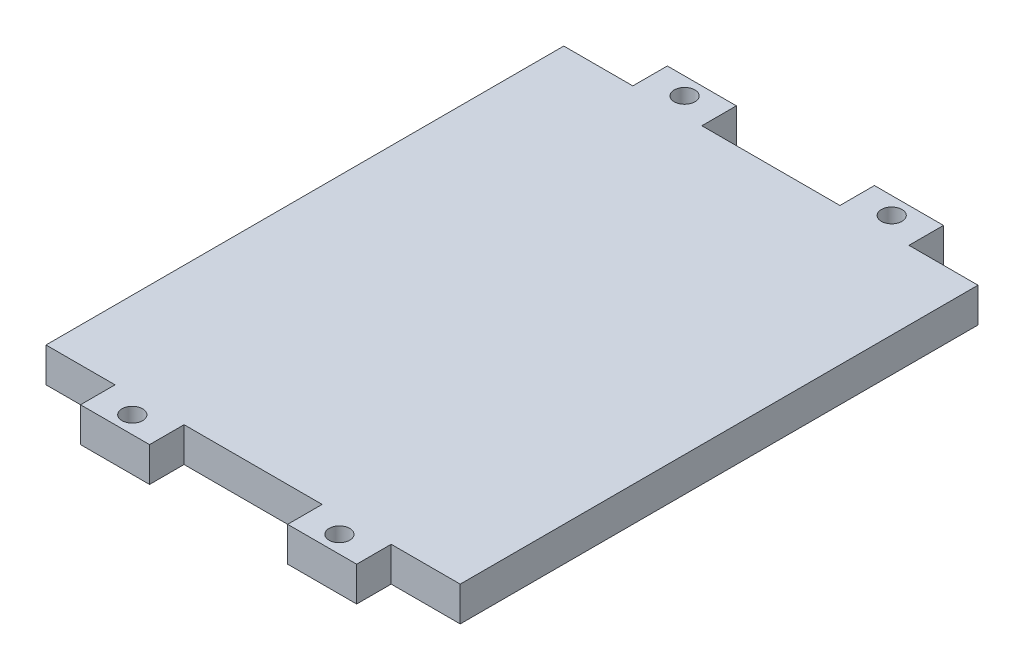
ISO-10303-21;
HEADER;
FILE_DESCRIPTION(('STEP AP214'),'2;1');
FILE_NAME('part.step','',(''),(''),'','','');
FILE_SCHEMA(('AUTOMOTIVE_DESIGN { 1 0 10303 214 1 1 1 1 }'));
ENDSEC;
DATA;
#1=APPLICATION_CONTEXT('core data for automotive mechanical design processes');
#2=APPLICATION_PROTOCOL_DEFINITION('international standard','automotive_design',2000,#1);
#3=PRODUCT_CONTEXT('',#1,'mechanical');
#4=PRODUCT('Part','Part','',(#3));
#5=PRODUCT_RELATED_PRODUCT_CATEGORY('part','',(#4));
#6=PRODUCT_DEFINITION_FORMATION('','',#4);
#7=PRODUCT_DEFINITION_CONTEXT('part definition',#1,'design');
#8=PRODUCT_DEFINITION('design','',#6,#7);
#9=PRODUCT_DEFINITION_SHAPE('','',#8);
#10=(LENGTH_UNIT() NAMED_UNIT(*) SI_UNIT(.MILLI.,.METRE.));
#11=(NAMED_UNIT(*) PLANE_ANGLE_UNIT() SI_UNIT($,.RADIAN.));
#12=(NAMED_UNIT(*) SI_UNIT($,.STERADIAN.) SOLID_ANGLE_UNIT());
#13=UNCERTAINTY_MEASURE_WITH_UNIT(LENGTH_MEASURE(1.E-05),#10,'distance_accuracy_value','');
#14=(GEOMETRIC_REPRESENTATION_CONTEXT(3) GLOBAL_UNCERTAINTY_ASSIGNED_CONTEXT((#13)) GLOBAL_UNIT_ASSIGNED_CONTEXT((#10,
#11,#12)) REPRESENTATION_CONTEXT('',''));
#15=CARTESIAN_POINT('',(0.,0.,0.));
#16=DIRECTION('',(0.,0.,1.));
#17=DIRECTION('',(1.,0.,0.));
#18=AXIS2_PLACEMENT_3D('',#15,#16,#17);
#19=CARTESIAN_POINT('',(-38.1,6.35,53.975));
#20=DIRECTION('',(0.,0.,-1.));
#21=DIRECTION('',(-1.,0.,0.));
#22=AXIS2_PLACEMENT_3D('',#19,#20,#21);
#23=PLANE('',#22);
#24=DIRECTION('',(1.,0.,0.));
#25=VECTOR('',#24,1.);
#26=CARTESIAN_POINT('',(-38.1,6.35,53.975));
#27=LINE('',#26,#25);
#28=CARTESIAN_POINT('',(-25.4,6.35,53.975));
#29=VERTEX_POINT('',#28);
#30=CARTESIAN_POINT('',(-12.6999999999999,6.35,53.975));
#31=VERTEX_POINT('',#30);
#32=EDGE_CURVE('E50',#29,#31,#27,.T.);
#33=ORIENTED_EDGE('',*,*,#32,.F.);
#34=DIRECTION('',(0.,1.,0.));
#35=VECTOR('',#34,1.);
#36=CARTESIAN_POINT('',(-25.4,0.,53.975));
#37=LINE('',#36,#35);
#38=CARTESIAN_POINT('',(-25.4,0.,53.975));
#39=VERTEX_POINT('',#38);
#40=EDGE_CURVE('E222',#39,#29,#37,.T.);
#41=ORIENTED_EDGE('',*,*,#40,.F.);
#42=DIRECTION('',(1.,0.,0.));
#43=VECTOR('',#42,1.);
#44=CARTESIAN_POINT('',(-38.1,0.,53.975));
#45=LINE('',#44,#43);
#46=CARTESIAN_POINT('',(-12.6999999999999,0.,53.975));
#47=VERTEX_POINT('',#46);
#48=EDGE_CURVE('E233',#39,#47,#45,.T.);
#49=ORIENTED_EDGE('',*,*,#48,.T.);
#50=DIRECTION('',(0.,1.,0.));
#51=VECTOR('',#50,1.);
#52=CARTESIAN_POINT('',(-12.6999999999999,0.,53.975));
#53=LINE('',#52,#51);
#54=EDGE_CURVE('E376',#47,#31,#53,.T.);
#55=ORIENTED_EDGE('',*,*,#54,.T.);
#56=EDGE_LOOP('',(#33,#41,#49,#55));
#57=FACE_BOUND('',#56,.T.);
#58=ADVANCED_FACE('F40',(#57),#23,.F.);
#59=CARTESIAN_POINT('',(-38.1,6.35,-53.975));
#60=DIRECTION('',(0.,0.,1.));
#61=DIRECTION('',(1.,0.,0.));
#62=AXIS2_PLACEMENT_3D('',#59,#60,#61);
#63=PLANE('',#62);
#64=DIRECTION('',(-1.,0.,0.));
#65=VECTOR('',#64,1.);
#66=CARTESIAN_POINT('',(-38.1,6.35,-53.975));
#67=LINE('',#66,#65);
#68=CARTESIAN_POINT('',(-12.7,6.35,-53.975));
#69=VERTEX_POINT('',#68);
#70=CARTESIAN_POINT('',(-25.4,6.35,-53.975));
#71=VERTEX_POINT('',#70);
#72=EDGE_CURVE('E246',#69,#71,#67,.T.);
#73=ORIENTED_EDGE('',*,*,#72,.F.);
#74=DIRECTION('',(0.,1.,0.));
#75=VECTOR('',#74,1.);
#76=CARTESIAN_POINT('',(-12.7,0.,-53.975));
#77=LINE('',#76,#75);
#78=CARTESIAN_POINT('',(-12.7,0.,-53.975));
#79=VERTEX_POINT('',#78);
#80=EDGE_CURVE('E287',#79,#69,#77,.T.);
#81=ORIENTED_EDGE('',*,*,#80,.F.);
#82=DIRECTION('',(-1.,0.,0.));
#83=VECTOR('',#82,1.);
#84=CARTESIAN_POINT('',(-38.1,0.,-53.975));
#85=LINE('',#84,#83);
#86=CARTESIAN_POINT('',(-25.4,0.,-53.975));
#87=VERTEX_POINT('',#86);
#88=EDGE_CURVE('E255',#79,#87,#85,.T.);
#89=ORIENTED_EDGE('',*,*,#88,.T.);
#90=DIRECTION('',(0.,1.,0.));
#91=VECTOR('',#90,1.);
#92=CARTESIAN_POINT('',(-25.4,0.,-53.975));
#93=LINE('',#92,#91);
#94=EDGE_CURVE('E274',#87,#71,#93,.T.);
#95=ORIENTED_EDGE('',*,*,#94,.T.);
#96=EDGE_LOOP('',(#73,#81,#89,#95));
#97=FACE_BOUND('',#96,.T.);
#98=ADVANCED_FACE('F490',(#97),#63,.F.);
#99=CARTESIAN_POINT('',(25.4,6.35,-53.975));
#100=VERTEX_POINT('',#99);
#101=CARTESIAN_POINT('',(12.7,6.35,-53.975));
#102=VERTEX_POINT('',#101);
#103=EDGE_CURVE('E264',#100,#102,#67,.T.);
#104=ORIENTED_EDGE('',*,*,#103,.F.);
#105=DIRECTION('',(0.,1.,0.));
#106=VECTOR('',#105,1.);
#107=CARTESIAN_POINT('',(25.4,0.,-53.975));
#108=LINE('',#107,#106);
#109=CARTESIAN_POINT('',(25.4,0.,-53.975));
#110=VERTEX_POINT('',#109);
#111=EDGE_CURVE('E331',#110,#100,#108,.T.);
#112=ORIENTED_EDGE('',*,*,#111,.F.);
#113=CARTESIAN_POINT('',(12.7,0.,-53.975));
#114=VERTEX_POINT('',#113);
#115=EDGE_CURVE('E253',#110,#114,#85,.T.);
#116=ORIENTED_EDGE('',*,*,#115,.T.);
#117=DIRECTION('',(0.,1.,0.));
#118=VECTOR('',#117,1.);
#119=CARTESIAN_POINT('',(12.7,0.,-53.975));
#120=LINE('',#119,#118);
#121=EDGE_CURVE('E301',#114,#102,#120,.T.);
#122=ORIENTED_EDGE('',*,*,#121,.T.);
#123=EDGE_LOOP('',(#104,#112,#116,#122));
#124=FACE_BOUND('',#123,.T.);
#125=ADVANCED_FACE('F42',(#124),#63,.F.);
#126=CARTESIAN_POINT('',(-38.1,6.35,-53.975));
#127=DIRECTION('',(1.,0.,0.));
#128=DIRECTION('',(0.,0.,-1.));
#129=AXIS2_PLACEMENT_3D('',#126,#127,#128);
#130=PLANE('',#129);
#131=DIRECTION('',(0.,0.,1.));
#132=VECTOR('',#131,1.);
#133=CARTESIAN_POINT('',(-38.1,0.,-53.975));
#134=LINE('',#133,#132);
#135=CARTESIAN_POINT('',(-38.1,0.,-47.625));
#136=VERTEX_POINT('',#135);
#137=CARTESIAN_POINT('',(-38.1,0.,47.625));
#138=VERTEX_POINT('',#137);
#139=EDGE_CURVE('E248',#136,#138,#134,.T.);
#140=ORIENTED_EDGE('',*,*,#139,.T.);
#141=DIRECTION('',(0.,1.,0.));
#142=VECTOR('',#141,1.);
#143=CARTESIAN_POINT('',(-38.1,0.,47.625));
#144=LINE('',#143,#142);
#145=CARTESIAN_POINT('',(-38.1,6.35,47.625));
#146=VERTEX_POINT('',#145);
#147=EDGE_CURVE('E407',#138,#146,#144,.T.);
#148=ORIENTED_EDGE('',*,*,#147,.T.);
#149=DIRECTION('',(0.,0.,1.));
#150=VECTOR('',#149,1.);
#151=CARTESIAN_POINT('',(-38.1,6.35,-53.975));
#152=LINE('',#151,#150);
#153=CARTESIAN_POINT('',(-38.1,6.35,-47.625));
#154=VERTEX_POINT('',#153);
#155=EDGE_CURVE('E260',#154,#146,#152,.T.);
#156=ORIENTED_EDGE('',*,*,#155,.F.);
#157=DIRECTION('',(0.,1.,0.));
#158=VECTOR('',#157,1.);
#159=CARTESIAN_POINT('',(-38.1,0.,-47.625));
#160=LINE('',#159,#158);
#161=EDGE_CURVE('E267',#136,#154,#160,.T.);
#162=ORIENTED_EDGE('',*,*,#161,.F.);
#163=EDGE_LOOP('',(#140,#148,#156,#162));
#164=FACE_BOUND('',#163,.T.);
#165=ADVANCED_FACE('F478',(#164),#130,.F.);
#166=CARTESIAN_POINT('',(12.7,6.35,53.975));
#167=VERTEX_POINT('',#166);
#168=CARTESIAN_POINT('',(25.4000000000001,6.35,53.975));
#169=VERTEX_POINT('',#168);
#170=EDGE_CURVE('E259',#167,#169,#27,.T.);
#171=ORIENTED_EDGE('',*,*,#170,.F.);
#172=DIRECTION('',(0.,1.,0.));
#173=VECTOR('',#172,1.);
#174=CARTESIAN_POINT('',(12.7,0.,53.975));
#175=LINE('',#174,#173);
#176=CARTESIAN_POINT('',(12.7,0.,53.975));
#177=VERTEX_POINT('',#176);
#178=EDGE_CURVE('E383',#177,#167,#175,.T.);
#179=ORIENTED_EDGE('',*,*,#178,.F.);
#180=CARTESIAN_POINT('',(25.4000000000001,0.,53.975));
#181=VERTEX_POINT('',#180);
#182=EDGE_CURVE('E242',#177,#181,#45,.T.);
#183=ORIENTED_EDGE('',*,*,#182,.T.);
#184=DIRECTION('',(0.,1.,0.));
#185=VECTOR('',#184,1.);
#186=CARTESIAN_POINT('',(25.4000000000001,0.,53.975));
#187=LINE('',#186,#185);
#188=EDGE_CURVE('E350',#181,#169,#187,.T.);
#189=ORIENTED_EDGE('',*,*,#188,.T.);
#190=EDGE_LOOP('',(#171,#179,#183,#189));
#191=FACE_BOUND('',#190,.T.);
#192=ADVANCED_FACE('F505',(#191),#23,.F.);
#193=CARTESIAN_POINT('',(38.1,6.35,-53.975));
#194=DIRECTION('',(-1.,0.,0.));
#195=DIRECTION('',(0.,0.,1.));
#196=AXIS2_PLACEMENT_3D('',#193,#194,#195);
#197=PLANE('',#196);
#198=DIRECTION('',(0.,0.,-1.));
#199=VECTOR('',#198,1.);
#200=CARTESIAN_POINT('',(38.1,6.35,-53.975));
#201=LINE('',#200,#199);
#202=CARTESIAN_POINT('',(38.1,6.35,47.625));
#203=VERTEX_POINT('',#202);
#204=CARTESIAN_POINT('',(38.1,6.35,-47.625));
#205=VERTEX_POINT('',#204);
#206=EDGE_CURVE('E11',#203,#205,#201,.T.);
#207=ORIENTED_EDGE('',*,*,#206,.F.);
#208=DIRECTION('',(0.,1.,0.));
#209=VECTOR('',#208,1.);
#210=CARTESIAN_POINT('',(38.1,0.,47.625));
#211=LINE('',#210,#209);
#212=CARTESIAN_POINT('',(38.1,0.,47.625));
#213=VERTEX_POINT('',#212);
#214=EDGE_CURVE('E357',#213,#203,#211,.T.);
#215=ORIENTED_EDGE('',*,*,#214,.F.);
#216=DIRECTION('',(0.,0.,-1.));
#217=VECTOR('',#216,1.);
#218=CARTESIAN_POINT('',(38.1,0.,-53.975));
#219=LINE('',#218,#217);
#220=CARTESIAN_POINT('',(38.1,0.,-47.625));
#221=VERTEX_POINT('',#220);
#222=EDGE_CURVE('E44',#213,#221,#219,.T.);
#223=ORIENTED_EDGE('',*,*,#222,.T.);
#224=DIRECTION('',(0.,1.,0.));
#225=VECTOR('',#224,1.);
#226=CARTESIAN_POINT('',(38.1,0.,-47.625));
#227=LINE('',#226,#225);
#228=EDGE_CURVE('E320',#221,#205,#227,.T.);
#229=ORIENTED_EDGE('',*,*,#228,.T.);
#230=EDGE_LOOP('',(#207,#215,#223,#229));
#231=FACE_BOUND('',#230,.T.);
#232=ADVANCED_FACE('F464',(#231),#197,.F.);
#233=CARTESIAN_POINT('',(0.,6.35,0.));
#234=DIRECTION('',(0.,-1.,0.));
#235=DIRECTION('',(0.,0.,-1.));
#236=AXIS2_PLACEMENT_3D('',#233,#234,#235);
#237=PLANE('',#236);
#238=CARTESIAN_POINT('',(-19.05,6.35,-50.8));
#239=DIRECTION('',(0.,1.,0.));
#240=DIRECTION('',(0.,0.,1.));
#241=AXIS2_PLACEMENT_3D('',#238,#239,#240);
#242=CIRCLE('',#241,1.89864999999999);
#243=CARTESIAN_POINT('',(-19.05,6.35,-48.90135));
#244=VERTEX_POINT('',#243);
#245=EDGE_CURVE('E453',#244,#244,#242,.T.);
#246=ORIENTED_EDGE('',*,*,#245,.F.);
#247=EDGE_LOOP('',(#246));
#248=FACE_BOUND('',#247,.T.);
#249=CARTESIAN_POINT('',(19.05,6.35,-50.8));
#250=DIRECTION('',(0.,1.,0.));
#251=DIRECTION('',(0.,0.,1.));
#252=AXIS2_PLACEMENT_3D('',#249,#250,#251);
#253=CIRCLE('',#252,1.89864999999999);
#254=CARTESIAN_POINT('',(19.05,6.35,-48.90135));
#255=VERTEX_POINT('',#254);
#256=EDGE_CURVE('E445',#255,#255,#253,.T.);
#257=ORIENTED_EDGE('',*,*,#256,.F.);
#258=EDGE_LOOP('',(#257));
#259=FACE_BOUND('',#258,.T.);
#260=CARTESIAN_POINT('',(-19.05,6.35,50.8));
#261=DIRECTION('',(0.,1.,0.));
#262=DIRECTION('',(0.,0.,1.));
#263=AXIS2_PLACEMENT_3D('',#260,#261,#262);
#264=CIRCLE('',#263,1.89864999999999);
#265=CARTESIAN_POINT('',(-19.05,6.35,52.69865));
#266=VERTEX_POINT('',#265);
#267=EDGE_CURVE('E437',#266,#266,#264,.T.);
#268=ORIENTED_EDGE('',*,*,#267,.F.);
#269=EDGE_LOOP('',(#268));
#270=FACE_BOUND('',#269,.T.);
#271=CARTESIAN_POINT('',(19.05,6.35,50.8));
#272=DIRECTION('',(0.,1.,0.));
#273=DIRECTION('',(0.,0.,1.));
#274=AXIS2_PLACEMENT_3D('',#271,#272,#273);
#275=CIRCLE('',#274,1.89864999999999);
#276=CARTESIAN_POINT('',(19.05,6.35,52.69865));
#277=VERTEX_POINT('',#276);
#278=EDGE_CURVE('E430',#277,#277,#275,.T.);
#279=ORIENTED_EDGE('',*,*,#278,.F.);
#280=EDGE_LOOP('',(#279));
#281=FACE_BOUND('',#280,.T.);
#282=ORIENTED_EDGE('',*,*,#155,.T.);
#283=DIRECTION('',(-1.,0.,0.));
#284=VECTOR('',#283,1.);
#285=CARTESIAN_POINT('',(-38.1,6.35,47.625));
#286=LINE('',#285,#284);
#287=CARTESIAN_POINT('',(-25.3999999999999,6.35,47.625));
#288=VERTEX_POINT('',#287);
#289=EDGE_CURVE('E228',#288,#146,#286,.T.);
#290=ORIENTED_EDGE('',*,*,#289,.F.);
#291=DIRECTION('',(0.,0.,-1.));
#292=VECTOR('',#291,1.);
#293=CARTESIAN_POINT('',(-25.4,6.35,53.975));
#294=LINE('',#293,#292);
#295=EDGE_CURVE('E421',#29,#288,#294,.T.);
#296=ORIENTED_EDGE('',*,*,#295,.F.);
#297=ORIENTED_EDGE('',*,*,#32,.T.);
#298=DIRECTION('',(0.,0.,1.));
#299=VECTOR('',#298,1.);
#300=CARTESIAN_POINT('',(-12.6999999999999,6.35,53.975));
#301=LINE('',#300,#299);
#302=CARTESIAN_POINT('',(-12.7,6.35,47.625));
#303=VERTEX_POINT('',#302);
#304=EDGE_CURVE('E394',#303,#31,#301,.T.);
#305=ORIENTED_EDGE('',*,*,#304,.F.);
#306=DIRECTION('',(-1.,0.,0.));
#307=VECTOR('',#306,1.);
#308=CARTESIAN_POINT('',(-12.7,6.35,47.625));
#309=LINE('',#308,#307);
#310=CARTESIAN_POINT('',(12.7000000000001,6.35,47.625));
#311=VERTEX_POINT('',#310);
#312=EDGE_CURVE('E399',#311,#303,#309,.T.);
#313=ORIENTED_EDGE('',*,*,#312,.F.);
#314=DIRECTION('',(0.,0.,-1.));
#315=VECTOR('',#314,1.);
#316=CARTESIAN_POINT('',(12.7,6.35,53.975));
#317=LINE('',#316,#315);
#318=EDGE_CURVE('E403',#167,#311,#317,.T.);
#319=ORIENTED_EDGE('',*,*,#318,.F.);
#320=ORIENTED_EDGE('',*,*,#170,.T.);
#321=DIRECTION('',(0.,0.,1.));
#322=VECTOR('',#321,1.);
#323=CARTESIAN_POINT('',(25.4000000000001,6.35,53.975));
#324=LINE('',#323,#322);
#325=CARTESIAN_POINT('',(25.4,6.35,47.625));
#326=VERTEX_POINT('',#325);
#327=EDGE_CURVE('E367',#326,#169,#324,.T.);
#328=ORIENTED_EDGE('',*,*,#327,.F.);
#329=DIRECTION('',(-1.,0.,0.));
#330=VECTOR('',#329,1.);
#331=CARTESIAN_POINT('',(38.1,6.35,47.625));
#332=LINE('',#331,#330);
#333=EDGE_CURVE('E372',#203,#326,#332,.T.);
#334=ORIENTED_EDGE('',*,*,#333,.F.);
#335=ORIENTED_EDGE('',*,*,#206,.T.);
#336=DIRECTION('',(1.,0.,0.));
#337=VECTOR('',#336,1.);
#338=CARTESIAN_POINT('',(38.1,6.35,-47.625));
#339=LINE('',#338,#337);
#340=CARTESIAN_POINT('',(25.4,6.35,-47.625));
#341=VERTEX_POINT('',#340);
#342=EDGE_CURVE('E341',#341,#205,#339,.T.);
#343=ORIENTED_EDGE('',*,*,#342,.F.);
#344=DIRECTION('',(0.,0.,1.));
#345=VECTOR('',#344,1.);
#346=CARTESIAN_POINT('',(25.4,6.35,-53.975));
#347=LINE('',#346,#345);
#348=EDGE_CURVE('E346',#100,#341,#347,.T.);
#349=ORIENTED_EDGE('',*,*,#348,.F.);
#350=ORIENTED_EDGE('',*,*,#103,.T.);
#351=DIRECTION('',(0.,0.,-1.));
#352=VECTOR('',#351,1.);
#353=CARTESIAN_POINT('',(12.7,6.35,-53.975));
#354=LINE('',#353,#352);
#355=CARTESIAN_POINT('',(12.7,6.35,-47.625));
#356=VERTEX_POINT('',#355);
#357=EDGE_CURVE('E307',#356,#102,#354,.T.);
#358=ORIENTED_EDGE('',*,*,#357,.F.);
#359=DIRECTION('',(1.,0.,0.));
#360=VECTOR('',#359,1.);
#361=CARTESIAN_POINT('',(-12.7,6.35,-47.625));
#362=LINE('',#361,#360);
#363=CARTESIAN_POINT('',(-12.7,6.35,-47.625));
#364=VERTEX_POINT('',#363);
#365=EDGE_CURVE('E312',#364,#356,#362,.T.);
#366=ORIENTED_EDGE('',*,*,#365,.F.);
#367=DIRECTION('',(0.,0.,1.));
#368=VECTOR('',#367,1.);
#369=CARTESIAN_POINT('',(-12.7,6.35,-53.975));
#370=LINE('',#369,#368);
#371=EDGE_CURVE('E316',#69,#364,#370,.T.);
#372=ORIENTED_EDGE('',*,*,#371,.F.);
#373=ORIENTED_EDGE('',*,*,#72,.T.);
#374=DIRECTION('',(0.,0.,-1.));
#375=VECTOR('',#374,1.);
#376=CARTESIAN_POINT('',(-25.4,6.35,-53.975));
#377=LINE('',#376,#375);
#378=CARTESIAN_POINT('',(-25.4,6.35,-47.625));
#379=VERTEX_POINT('',#378);
#380=EDGE_CURVE('E278',#379,#71,#377,.T.);
#381=ORIENTED_EDGE('',*,*,#380,.F.);
#382=DIRECTION('',(1.,0.,0.));
#383=VECTOR('',#382,1.);
#384=CARTESIAN_POINT('',(-38.1,6.35,-47.625));
#385=LINE('',#384,#383);
#386=EDGE_CURVE('E283',#154,#379,#385,.T.);
#387=ORIENTED_EDGE('',*,*,#386,.F.);
#388=EDGE_LOOP('',(#282,#290,#296,#297,#305,#313,#319,#320,#328,#334,#335,#343,#349,#350,#358,
#366,#372,#373,#381,#387));
#389=FACE_BOUND('',#388,.T.);
#390=ADVANCED_FACE('F461',(#248,#259,#270,#281,#389),#237,.F.);
#391=CARTESIAN_POINT('',(0.,0.,0.));
#392=DIRECTION('',(0.,-1.,0.));
#393=DIRECTION('',(0.,0.,-1.));
#394=AXIS2_PLACEMENT_3D('',#391,#392,#393);
#395=PLANE('',#394);
#396=CARTESIAN_POINT('',(-19.05,0.,-50.8));
#397=DIRECTION('',(0.,1.,0.));
#398=DIRECTION('',(0.,0.,1.));
#399=AXIS2_PLACEMENT_3D('',#396,#397,#398);
#400=CIRCLE('',#399,1.89864999999999);
#401=CARTESIAN_POINT('',(-19.05,0.,-48.90135));
#402=VERTEX_POINT('',#401);
#403=EDGE_CURVE('E449',#402,#402,#400,.T.);
#404=ORIENTED_EDGE('',*,*,#403,.T.);
#405=EDGE_LOOP('',(#404));
#406=FACE_BOUND('',#405,.T.);
#407=CARTESIAN_POINT('',(19.05,0.,-50.8));
#408=DIRECTION('',(0.,1.,0.));
#409=DIRECTION('',(0.,0.,1.));
#410=AXIS2_PLACEMENT_3D('',#407,#408,#409);
#411=CIRCLE('',#410,1.89864999999999);
#412=CARTESIAN_POINT('',(19.05,0.,-48.90135));
#413=VERTEX_POINT('',#412);
#414=EDGE_CURVE('E441',#413,#413,#411,.T.);
#415=ORIENTED_EDGE('',*,*,#414,.T.);
#416=EDGE_LOOP('',(#415));
#417=FACE_BOUND('',#416,.T.);
#418=CARTESIAN_POINT('',(-19.05,0.,50.8));
#419=DIRECTION('',(0.,1.,0.));
#420=DIRECTION('',(0.,0.,1.));
#421=AXIS2_PLACEMENT_3D('',#418,#419,#420);
#422=CIRCLE('',#421,1.89864999999999);
#423=CARTESIAN_POINT('',(-19.05,0.,52.69865));
#424=VERTEX_POINT('',#423);
#425=EDGE_CURVE('E434',#424,#424,#422,.T.);
#426=ORIENTED_EDGE('',*,*,#425,.T.);
#427=EDGE_LOOP('',(#426));
#428=FACE_BOUND('',#427,.T.);
#429=CARTESIAN_POINT('',(19.05,0.,50.8));
#430=DIRECTION('',(0.,1.,0.));
#431=DIRECTION('',(0.,0.,1.));
#432=AXIS2_PLACEMENT_3D('',#429,#430,#431);
#433=CIRCLE('',#432,1.89864999999999);
#434=CARTESIAN_POINT('',(19.05,0.,52.69865));
#435=VERTEX_POINT('',#434);
#436=EDGE_CURVE('E424',#435,#435,#433,.T.);
#437=ORIENTED_EDGE('',*,*,#436,.T.);
#438=EDGE_LOOP('',(#437));
#439=FACE_BOUND('',#438,.T.);
#440=DIRECTION('',(-1.,0.,0.));
#441=VECTOR('',#440,1.);
#442=CARTESIAN_POINT('',(-38.1,0.,47.625));
#443=LINE('',#442,#441);
#444=CARTESIAN_POINT('',(-25.3999999999999,0.,47.625));
#445=VERTEX_POINT('',#444);
#446=EDGE_CURVE('E61',#445,#138,#443,.T.);
#447=ORIENTED_EDGE('',*,*,#446,.T.);
#448=ORIENTED_EDGE('',*,*,#139,.F.);
#449=DIRECTION('',(1.,0.,0.));
#450=VECTOR('',#449,1.);
#451=CARTESIAN_POINT('',(-38.1,0.,-47.625));
#452=LINE('',#451,#450);
#453=CARTESIAN_POINT('',(-25.4,0.,-47.625));
#454=VERTEX_POINT('',#453);
#455=EDGE_CURVE('E282',#136,#454,#452,.T.);
#456=ORIENTED_EDGE('',*,*,#455,.T.);
#457=DIRECTION('',(0.,0.,-1.));
#458=VECTOR('',#457,1.);
#459=CARTESIAN_POINT('',(-25.4,0.,-53.975));
#460=LINE('',#459,#458);
#461=EDGE_CURVE('E271',#454,#87,#460,.T.);
#462=ORIENTED_EDGE('',*,*,#461,.T.);
#463=ORIENTED_EDGE('',*,*,#88,.F.);
#464=DIRECTION('',(0.,0.,1.));
#465=VECTOR('',#464,1.);
#466=CARTESIAN_POINT('',(-12.7,0.,-53.975));
#467=LINE('',#466,#465);
#468=CARTESIAN_POINT('',(-12.7,0.,-47.625));
#469=VERTEX_POINT('',#468);
#470=EDGE_CURVE('E311',#79,#469,#467,.T.);
#471=ORIENTED_EDGE('',*,*,#470,.T.);
#472=DIRECTION('',(1.,0.,0.));
#473=VECTOR('',#472,1.);
#474=CARTESIAN_POINT('',(-12.7,0.,-47.625));
#475=LINE('',#474,#473);
#476=CARTESIAN_POINT('',(12.7,0.,-47.625));
#477=VERTEX_POINT('',#476);
#478=EDGE_CURVE('E324',#469,#477,#475,.T.);
#479=ORIENTED_EDGE('',*,*,#478,.T.);
#480=DIRECTION('',(0.,0.,-1.));
#481=VECTOR('',#480,1.);
#482=CARTESIAN_POINT('',(12.7,0.,-53.975));
#483=LINE('',#482,#481);
#484=EDGE_CURVE('E298',#477,#114,#483,.T.);
#485=ORIENTED_EDGE('',*,*,#484,.T.);
#486=ORIENTED_EDGE('',*,*,#115,.F.);
#487=DIRECTION('',(0.,0.,1.));
#488=VECTOR('',#487,1.);
#489=CARTESIAN_POINT('',(25.4,0.,-53.975));
#490=LINE('',#489,#488);
#491=CARTESIAN_POINT('',(25.4,0.,-47.625));
#492=VERTEX_POINT('',#491);
#493=EDGE_CURVE('E345',#110,#492,#490,.T.);
#494=ORIENTED_EDGE('',*,*,#493,.T.);
#495=DIRECTION('',(1.,0.,0.));
#496=VECTOR('',#495,1.);
#497=CARTESIAN_POINT('',(38.1,0.,-47.625));
#498=LINE('',#497,#496);
#499=EDGE_CURVE('E335',#492,#221,#498,.T.);
#500=ORIENTED_EDGE('',*,*,#499,.T.);
#501=ORIENTED_EDGE('',*,*,#222,.F.);
#502=DIRECTION('',(-1.,0.,0.));
#503=VECTOR('',#502,1.);
#504=CARTESIAN_POINT('',(38.1,0.,47.625));
#505=LINE('',#504,#503);
#506=CARTESIAN_POINT('',(25.4,0.,47.625));
#507=VERTEX_POINT('',#506);
#508=EDGE_CURVE('E371',#213,#507,#505,.T.);
#509=ORIENTED_EDGE('',*,*,#508,.T.);
#510=DIRECTION('',(0.,0.,1.));
#511=VECTOR('',#510,1.);
#512=CARTESIAN_POINT('',(25.4000000000001,0.,53.975));
#513=LINE('',#512,#511);
#514=EDGE_CURVE('E361',#507,#181,#513,.T.);
#515=ORIENTED_EDGE('',*,*,#514,.T.);
#516=ORIENTED_EDGE('',*,*,#182,.F.);
#517=DIRECTION('',(0.,0.,-1.));
#518=VECTOR('',#517,1.);
#519=CARTESIAN_POINT('',(12.7,0.,53.975));
#520=LINE('',#519,#518);
#521=CARTESIAN_POINT('',(12.7000000000001,0.,47.625));
#522=VERTEX_POINT('',#521);
#523=EDGE_CURVE('E398',#177,#522,#520,.T.);
#524=ORIENTED_EDGE('',*,*,#523,.T.);
#525=DIRECTION('',(-1.,0.,0.));
#526=VECTOR('',#525,1.);
#527=CARTESIAN_POINT('',(-12.7,0.,47.625));
#528=LINE('',#527,#526);
#529=CARTESIAN_POINT('',(-12.7,0.,47.625));
#530=VERTEX_POINT('',#529);
#531=EDGE_CURVE('E72',#522,#530,#528,.T.);
#532=ORIENTED_EDGE('',*,*,#531,.T.);
#533=DIRECTION('',(0.,0.,1.));
#534=VECTOR('',#533,1.);
#535=CARTESIAN_POINT('',(-12.6999999999999,0.,53.975));
#536=LINE('',#535,#534);
#537=EDGE_CURVE('E240',#530,#47,#536,.T.);
#538=ORIENTED_EDGE('',*,*,#537,.T.);
#539=ORIENTED_EDGE('',*,*,#48,.F.);
#540=DIRECTION('',(0.,0.,-1.));
#541=VECTOR('',#540,1.);
#542=CARTESIAN_POINT('',(-25.4,0.,53.975));
#543=LINE('',#542,#541);
#544=EDGE_CURVE('E218',#39,#445,#543,.T.);
#545=ORIENTED_EDGE('',*,*,#544,.T.);
#546=EDGE_LOOP('',(#447,#448,#456,#462,#463,#471,#479,#485,#486,#494,#500,#501,#509,#515,#516,
#524,#532,#538,#539,#545));
#547=FACE_BOUND('',#546,.T.);
#548=ADVANCED_FACE('F238',(#406,#417,#428,#439,#547),#395,.T.);
#549=CARTESIAN_POINT('',(-25.4,0.,-53.975));
#550=DIRECTION('',(1.,0.,0.));
#551=DIRECTION('',(0.,0.,-1.));
#552=AXIS2_PLACEMENT_3D('',#549,#550,#551);
#553=PLANE('',#552);
#554=ORIENTED_EDGE('',*,*,#380,.T.);
#555=ORIENTED_EDGE('',*,*,#94,.F.);
#556=ORIENTED_EDGE('',*,*,#461,.F.);
#557=DIRECTION('',(0.,1.,0.));
#558=VECTOR('',#557,1.);
#559=CARTESIAN_POINT('',(-25.4,0.,-47.625));
#560=LINE('',#559,#558);
#561=EDGE_CURVE('E270',#454,#379,#560,.T.);
#562=ORIENTED_EDGE('',*,*,#561,.T.);
#563=EDGE_LOOP('',(#554,#555,#556,#562));
#564=FACE_BOUND('',#563,.T.);
#565=ADVANCED_FACE('F486',(#564),#553,.F.);
#566=CARTESIAN_POINT('',(-38.1,0.,-47.625));
#567=DIRECTION('',(0.,0.,1.));
#568=DIRECTION('',(1.,0.,0.));
#569=AXIS2_PLACEMENT_3D('',#566,#567,#568);
#570=PLANE('',#569);
#571=ORIENTED_EDGE('',*,*,#386,.T.);
#572=ORIENTED_EDGE('',*,*,#561,.F.);
#573=ORIENTED_EDGE('',*,*,#455,.F.);
#574=ORIENTED_EDGE('',*,*,#161,.T.);
#575=EDGE_LOOP('',(#571,#572,#573,#574));
#576=FACE_BOUND('',#575,.T.);
#577=ADVANCED_FACE('F484',(#576),#570,.F.);
#578=CARTESIAN_POINT('',(-12.7,0.,-53.975));
#579=DIRECTION('',(-1.,0.,0.));
#580=DIRECTION('',(0.,0.,1.));
#581=AXIS2_PLACEMENT_3D('',#578,#579,#580);
#582=PLANE('',#581);
#583=ORIENTED_EDGE('',*,*,#371,.T.);
#584=DIRECTION('',(0.,1.,0.));
#585=VECTOR('',#584,1.);
#586=CARTESIAN_POINT('',(-12.7,0.,-47.625));
#587=LINE('',#586,#585);
#588=EDGE_CURVE('E294',#469,#364,#587,.T.);
#589=ORIENTED_EDGE('',*,*,#588,.F.);
#590=ORIENTED_EDGE('',*,*,#470,.F.);
#591=ORIENTED_EDGE('',*,*,#80,.T.);
#592=EDGE_LOOP('',(#583,#589,#590,#591));
#593=FACE_BOUND('',#592,.T.);
#594=ADVANCED_FACE('F536',(#593),#582,.F.);
#595=CARTESIAN_POINT('',(12.7,0.,-53.975));
#596=DIRECTION('',(1.,0.,0.));
#597=DIRECTION('',(0.,0.,-1.));
#598=AXIS2_PLACEMENT_3D('',#595,#596,#597);
#599=PLANE('',#598);
#600=ORIENTED_EDGE('',*,*,#357,.T.);
#601=ORIENTED_EDGE('',*,*,#121,.F.);
#602=ORIENTED_EDGE('',*,*,#484,.F.);
#603=DIRECTION('',(0.,1.,0.));
#604=VECTOR('',#603,1.);
#605=CARTESIAN_POINT('',(12.7,0.,-47.625));
#606=LINE('',#605,#604);
#607=EDGE_CURVE('E297',#477,#356,#606,.T.);
#608=ORIENTED_EDGE('',*,*,#607,.T.);
#609=EDGE_LOOP('',(#600,#601,#602,#608));
#610=FACE_BOUND('',#609,.T.);
#611=ADVANCED_FACE('F529',(#610),#599,.F.);
#612=CARTESIAN_POINT('',(-12.7,0.,-47.625));
#613=DIRECTION('',(0.,0.,1.));
#614=DIRECTION('',(1.,0.,0.));
#615=AXIS2_PLACEMENT_3D('',#612,#613,#614);
#616=PLANE('',#615);
#617=ORIENTED_EDGE('',*,*,#365,.T.);
#618=ORIENTED_EDGE('',*,*,#607,.F.);
#619=ORIENTED_EDGE('',*,*,#478,.F.);
#620=ORIENTED_EDGE('',*,*,#588,.T.);
#621=EDGE_LOOP('',(#617,#618,#619,#620));
#622=FACE_BOUND('',#621,.T.);
#623=ADVANCED_FACE('F533',(#622),#616,.F.);
#624=CARTESIAN_POINT('',(38.1,0.,-47.625));
#625=DIRECTION('',(0.,0.,1.));
#626=DIRECTION('',(1.,0.,0.));
#627=AXIS2_PLACEMENT_3D('',#624,#625,#626);
#628=PLANE('',#627);
#629=ORIENTED_EDGE('',*,*,#342,.T.);
#630=ORIENTED_EDGE('',*,*,#228,.F.);
#631=ORIENTED_EDGE('',*,*,#499,.F.);
#632=DIRECTION('',(0.,1.,0.));
#633=VECTOR('',#632,1.);
#634=CARTESIAN_POINT('',(25.4,0.,-47.625));
#635=LINE('',#634,#633);
#636=EDGE_CURVE('E334',#492,#341,#635,.T.);
#637=ORIENTED_EDGE('',*,*,#636,.T.);
#638=EDGE_LOOP('',(#629,#630,#631,#637));
#639=FACE_BOUND('',#638,.T.);
#640=ADVANCED_FACE('F516',(#639),#628,.F.);
#641=CARTESIAN_POINT('',(25.4,0.,-53.975));
#642=DIRECTION('',(-1.,0.,0.));
#643=DIRECTION('',(0.,0.,1.));
#644=AXIS2_PLACEMENT_3D('',#641,#642,#643);
#645=PLANE('',#644);
#646=ORIENTED_EDGE('',*,*,#348,.T.);
#647=ORIENTED_EDGE('',*,*,#636,.F.);
#648=ORIENTED_EDGE('',*,*,#493,.F.);
#649=ORIENTED_EDGE('',*,*,#111,.T.);
#650=EDGE_LOOP('',(#646,#647,#648,#649));
#651=FACE_BOUND('',#650,.T.);
#652=ADVANCED_FACE('F521',(#651),#645,.F.);
#653=CARTESIAN_POINT('',(25.4000000000001,0.,53.975));
#654=DIRECTION('',(-1.,0.,0.));
#655=DIRECTION('',(0.,0.,1.));
#656=AXIS2_PLACEMENT_3D('',#653,#654,#655);
#657=PLANE('',#656);
#658=ORIENTED_EDGE('',*,*,#327,.T.);
#659=ORIENTED_EDGE('',*,*,#188,.F.);
#660=ORIENTED_EDGE('',*,*,#514,.F.);
#661=DIRECTION('',(0.,1.,0.));
#662=VECTOR('',#661,1.);
#663=CARTESIAN_POINT('',(25.4,0.,47.625));
#664=LINE('',#663,#662);
#665=EDGE_CURVE('E360',#507,#326,#664,.T.);
#666=ORIENTED_EDGE('',*,*,#665,.T.);
#667=EDGE_LOOP('',(#658,#659,#660,#666));
#668=FACE_BOUND('',#667,.T.);
#669=ADVANCED_FACE('F503',(#668),#657,.F.);
#670=CARTESIAN_POINT('',(38.1,0.,47.625));
#671=DIRECTION('',(0.,0.,-1.));
#672=DIRECTION('',(-1.,0.,0.));
#673=AXIS2_PLACEMENT_3D('',#670,#671,#672);
#674=PLANE('',#673);
#675=ORIENTED_EDGE('',*,*,#333,.T.);
#676=ORIENTED_EDGE('',*,*,#665,.F.);
#677=ORIENTED_EDGE('',*,*,#508,.F.);
#678=ORIENTED_EDGE('',*,*,#214,.T.);
#679=EDGE_LOOP('',(#675,#676,#677,#678));
#680=FACE_BOUND('',#679,.T.);
#681=ADVANCED_FACE('F509',(#680),#674,.F.);
#682=CARTESIAN_POINT('',(-12.6999999999999,0.,53.975));
#683=DIRECTION('',(-1.,0.,0.));
#684=DIRECTION('',(0.,0.,1.));
#685=AXIS2_PLACEMENT_3D('',#682,#683,#684);
#686=PLANE('',#685);
#687=ORIENTED_EDGE('',*,*,#304,.T.);
#688=ORIENTED_EDGE('',*,*,#54,.F.);
#689=ORIENTED_EDGE('',*,*,#537,.F.);
#690=DIRECTION('',(0.,1.,0.));
#691=VECTOR('',#690,1.);
#692=CARTESIAN_POINT('',(-12.7,0.,47.625));
#693=LINE('',#692,#691);
#694=EDGE_CURVE('E389',#530,#303,#693,.T.);
#695=ORIENTED_EDGE('',*,*,#694,.T.);
#696=EDGE_LOOP('',(#687,#688,#689,#695));
#697=FACE_BOUND('',#696,.T.);
#698=ADVANCED_FACE('F654',(#697),#686,.F.);
#699=CARTESIAN_POINT('',(-12.7,0.,47.625));
#700=DIRECTION('',(0.,0.,-1.));
#701=DIRECTION('',(-1.,0.,0.));
#702=AXIS2_PLACEMENT_3D('',#699,#700,#701);
#703=PLANE('',#702);
#704=ORIENTED_EDGE('',*,*,#312,.T.);
#705=ORIENTED_EDGE('',*,*,#694,.F.);
#706=ORIENTED_EDGE('',*,*,#531,.F.);
#707=DIRECTION('',(0.,1.,0.));
#708=VECTOR('',#707,1.);
#709=CARTESIAN_POINT('',(12.7000000000001,0.,47.625));
#710=LINE('',#709,#708);
#711=EDGE_CURVE('E386',#522,#311,#710,.T.);
#712=ORIENTED_EDGE('',*,*,#711,.T.);
#713=EDGE_LOOP('',(#704,#705,#706,#712));
#714=FACE_BOUND('',#713,.T.);
#715=ADVANCED_FACE('F662',(#714),#703,.F.);
#716=CARTESIAN_POINT('',(12.7,0.,53.975));
#717=DIRECTION('',(1.,0.,0.));
#718=DIRECTION('',(0.,0.,-1.));
#719=AXIS2_PLACEMENT_3D('',#716,#717,#718);
#720=PLANE('',#719);
#721=ORIENTED_EDGE('',*,*,#318,.T.);
#722=ORIENTED_EDGE('',*,*,#711,.F.);
#723=ORIENTED_EDGE('',*,*,#523,.F.);
#724=ORIENTED_EDGE('',*,*,#178,.T.);
#725=EDGE_LOOP('',(#721,#722,#723,#724));
#726=FACE_BOUND('',#725,.T.);
#727=ADVANCED_FACE('F671',(#726),#720,.F.);
#728=CARTESIAN_POINT('',(-38.1,0.,47.625));
#729=DIRECTION('',(0.,0.,-1.));
#730=DIRECTION('',(-1.,0.,0.));
#731=AXIS2_PLACEMENT_3D('',#728,#729,#730);
#732=PLANE('',#731);
#733=ORIENTED_EDGE('',*,*,#289,.T.);
#734=ORIENTED_EDGE('',*,*,#147,.F.);
#735=ORIENTED_EDGE('',*,*,#446,.F.);
#736=DIRECTION('',(0.,1.,0.));
#737=VECTOR('',#736,1.);
#738=CARTESIAN_POINT('',(-25.3999999999999,0.,47.625));
#739=LINE('',#738,#737);
#740=EDGE_CURVE('E224',#445,#288,#739,.T.);
#741=ORIENTED_EDGE('',*,*,#740,.T.);
#742=EDGE_LOOP('',(#733,#734,#735,#741));
#743=FACE_BOUND('',#742,.T.);
#744=ADVANCED_FACE('F480',(#743),#732,.F.);
#745=CARTESIAN_POINT('',(-25.4,0.,53.975));
#746=DIRECTION('',(1.,0.,0.));
#747=DIRECTION('',(0.,0.,-1.));
#748=AXIS2_PLACEMENT_3D('',#745,#746,#747);
#749=PLANE('',#748);
#750=ORIENTED_EDGE('',*,*,#295,.T.);
#751=ORIENTED_EDGE('',*,*,#740,.F.);
#752=ORIENTED_EDGE('',*,*,#544,.F.);
#753=ORIENTED_EDGE('',*,*,#40,.T.);
#754=EDGE_LOOP('',(#750,#751,#752,#753));
#755=FACE_BOUND('',#754,.T.);
#756=ADVANCED_FACE('F221',(#755),#749,.F.);
#757=CARTESIAN_POINT('',(19.05,6.35,50.8));
#758=DIRECTION('',(0.,1.,0.));
#759=DIRECTION('',(0.,0.,1.));
#760=AXIS2_PLACEMENT_3D('',#757,#758,#759);
#761=CYLINDRICAL_SURFACE('',#760,1.89864999999999);
#762=ORIENTED_EDGE('',*,*,#436,.F.);
#763=EDGE_LOOP('',(#762));
#764=FACE_BOUND('',#763,.T.);
#765=ORIENTED_EDGE('',*,*,#278,.T.);
#766=EDGE_LOOP('',(#765));
#767=FACE_BOUND('',#766,.T.);
#768=ADVANCED_FACE('F693',(#764,#767),#761,.F.);
#769=CARTESIAN_POINT('',(-19.05,6.35,50.8));
#770=DIRECTION('',(0.,1.,0.));
#771=DIRECTION('',(0.,0.,1.));
#772=AXIS2_PLACEMENT_3D('',#769,#770,#771);
#773=CYLINDRICAL_SURFACE('',#772,1.89864999999999);
#774=ORIENTED_EDGE('',*,*,#425,.F.);
#775=EDGE_LOOP('',(#774));
#776=FACE_BOUND('',#775,.T.);
#777=ORIENTED_EDGE('',*,*,#267,.T.);
#778=EDGE_LOOP('',(#777));
#779=FACE_BOUND('',#778,.T.);
#780=ADVANCED_FACE('F700',(#776,#779),#773,.F.);
#781=CARTESIAN_POINT('',(19.05,6.35,-50.8));
#782=DIRECTION('',(0.,1.,0.));
#783=DIRECTION('',(0.,0.,1.));
#784=AXIS2_PLACEMENT_3D('',#781,#782,#783);
#785=CYLINDRICAL_SURFACE('',#784,1.89864999999999);
#786=ORIENTED_EDGE('',*,*,#414,.F.);
#787=EDGE_LOOP('',(#786));
#788=FACE_BOUND('',#787,.T.);
#789=ORIENTED_EDGE('',*,*,#256,.T.);
#790=EDGE_LOOP('',(#789));
#791=FACE_BOUND('',#790,.T.);
#792=ADVANCED_FACE('F709',(#788,#791),#785,.F.);
#793=CARTESIAN_POINT('',(-19.05,6.35,-50.8));
#794=DIRECTION('',(0.,1.,0.));
#795=DIRECTION('',(0.,0.,1.));
#796=AXIS2_PLACEMENT_3D('',#793,#794,#795);
#797=CYLINDRICAL_SURFACE('',#796,1.89864999999999);
#798=ORIENTED_EDGE('',*,*,#403,.F.);
#799=EDGE_LOOP('',(#798));
#800=FACE_BOUND('',#799,.T.);
#801=ORIENTED_EDGE('',*,*,#245,.T.);
#802=EDGE_LOOP('',(#801));
#803=FACE_BOUND('',#802,.T.);
#804=ADVANCED_FACE('F459',(#800,#803),#797,.F.);
#805=CLOSED_SHELL('',(#58,#98,#125,#165,#192,#232,#390,#548,#565,#577,#594,#611,#623,#640,#652,
#669,#681,#698,#715,#727,#744,#756,#768,#780,#792,#804));
#806=MANIFOLD_SOLID_BREP('B2',#805);
#807=ADVANCED_BREP_SHAPE_REPRESENTATION('',(#18,#806),#14);
#808=SHAPE_DEFINITION_REPRESENTATION(#9,#807);
ENDSEC;
END-ISO-10303-21;
